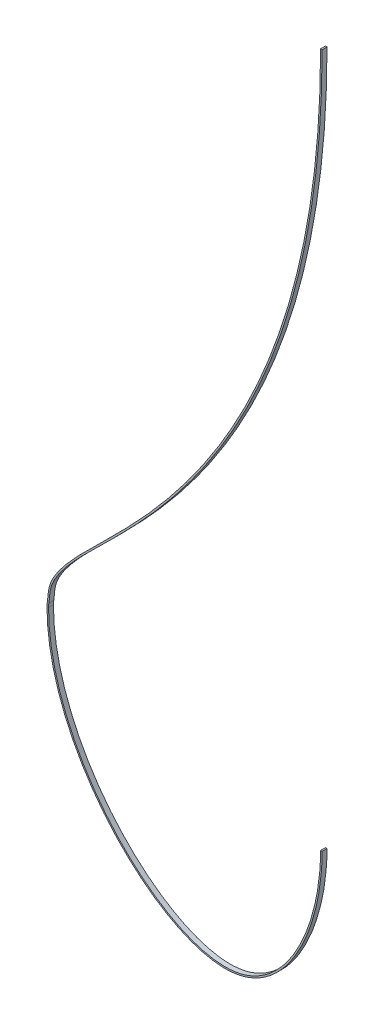
ISO-10303-21;
HEADER;
FILE_DESCRIPTION(('STEP AP214'),'2;1');
FILE_NAME('part.step','',(''),(''),'','','');
FILE_SCHEMA(('AUTOMOTIVE_DESIGN { 1 0 10303 214 1 1 1 1 }'));
ENDSEC;
DATA;
#1=APPLICATION_CONTEXT('core data for automotive mechanical design processes');
#2=APPLICATION_PROTOCOL_DEFINITION('international standard','automotive_design',2000,#1);
#3=PRODUCT_CONTEXT('',#1,'mechanical');
#4=PRODUCT('Part','Part','',(#3));
#5=PRODUCT_RELATED_PRODUCT_CATEGORY('part','',(#4));
#6=PRODUCT_DEFINITION_FORMATION('','',#4);
#7=PRODUCT_DEFINITION_CONTEXT('part definition',#1,'design');
#8=PRODUCT_DEFINITION('design','',#6,#7);
#9=PRODUCT_DEFINITION_SHAPE('','',#8);
#10=(LENGTH_UNIT() NAMED_UNIT(*) SI_UNIT(.MILLI.,.METRE.));
#11=(NAMED_UNIT(*) PLANE_ANGLE_UNIT() SI_UNIT($,.RADIAN.));
#12=(NAMED_UNIT(*) SI_UNIT($,.STERADIAN.) SOLID_ANGLE_UNIT());
#13=UNCERTAINTY_MEASURE_WITH_UNIT(LENGTH_MEASURE(1.E-05),#10,'distance_accuracy_value','');
#14=(GEOMETRIC_REPRESENTATION_CONTEXT(3) GLOBAL_UNCERTAINTY_ASSIGNED_CONTEXT((#13)) GLOBAL_UNIT_ASSIGNED_CONTEXT((#10,
#11,#12)) REPRESENTATION_CONTEXT('',''));
#15=CARTESIAN_POINT('',(0.,0.,0.));
#16=DIRECTION('',(0.,0.,1.));
#17=DIRECTION('',(1.,0.,0.));
#18=AXIS2_PLACEMENT_3D('',#15,#16,#17);
#19=CARTESIAN_POINT('',(-662.178,457.2,0.));
#20=DIRECTION('',(0.,0.,1.));
#21=DIRECTION('',(1.,0.,0.));
#22=AXIS2_PLACEMENT_3D('',#19,#20,#21);
#23=CYLINDRICAL_SURFACE('',#22,52.3875);
#24=DIRECTION('',(0.,0.,1.));
#25=VECTOR('',#24,1.);
#26=CARTESIAN_POINT('',(-713.845904547921,465.853195703148,-5.00000000000004));
#27=LINE('',#26,#25);
#28=CARTESIAN_POINT('',(-713.845904547921,465.853195703148,-5.00000000000004));
#29=VERTEX_POINT('',#28);
#30=CARTESIAN_POINT('',(-713.845904547921,465.853195703148,4.99999999999996));
#31=VERTEX_POINT('',#30);
#32=EDGE_CURVE('E129',#29,#31,#27,.T.);
#33=ORIENTED_EDGE('',*,*,#32,.F.);
#34=CARTESIAN_POINT('',(-662.178,457.2,-5.00000000000004));
#35=DIRECTION('',(0.,0.,1.));
#36=DIRECTION('',(1.,0.,0.));
#37=AXIS2_PLACEMENT_3D('',#34,#35,#36);
#38=CIRCLE('',#37,52.3875);
#39=CARTESIAN_POINT('',(-714.5655,457.199999999998,-5.00000000000004));
#40=VERTEX_POINT('',#39);
#41=EDGE_CURVE('E170',#29,#40,#38,.T.);
#42=ORIENTED_EDGE('',*,*,#41,.T.);
#43=DIRECTION('',(0.,0.,1.));
#44=VECTOR('',#43,1.);
#45=CARTESIAN_POINT('',(-714.5655,457.199999999998,-5.00000000000004));
#46=LINE('',#45,#44);
#47=CARTESIAN_POINT('',(-714.5655,457.199999999998,4.99999999999996));
#48=VERTEX_POINT('',#47);
#49=EDGE_CURVE('E166',#40,#48,#46,.T.);
#50=ORIENTED_EDGE('',*,*,#49,.T.);
#51=CARTESIAN_POINT('',(-662.178,457.2,4.99999999999996));
#52=DIRECTION('',(0.,0.,1.));
#53=DIRECTION('',(1.,0.,0.));
#54=AXIS2_PLACEMENT_3D('',#51,#52,#53);
#55=CIRCLE('',#54,52.3875);
#56=EDGE_CURVE('E77',#31,#48,#55,.T.);
#57=ORIENTED_EDGE('',*,*,#56,.F.);
#58=EDGE_LOOP('',(#33,#42,#50,#57));
#59=FACE_BOUND('',#58,.T.);
#60=ADVANCED_FACE('F69',(#59),#23,.T.);
#61=CARTESIAN_POINT('',(-662.178,457.2,0.));
#62=DIRECTION('',(0.,0.,1.));
#63=DIRECTION('',(1.,0.,0.));
#64=AXIS2_PLACEMENT_3D('',#61,#62,#63);
#65=CYLINDRICAL_SURFACE('',#64,49.2125);
#66=DIRECTION('',(0.,0.,-1.));
#67=VECTOR('',#66,1.);
#68=CARTESIAN_POINT('',(-710.714516393501,465.328759599926,-5.00000000000004));
#69=LINE('',#68,#67);
#70=CARTESIAN_POINT('',(-710.714516393501,465.328759599926,4.99999999999996));
#71=VERTEX_POINT('',#70);
#72=CARTESIAN_POINT('',(-710.714516393501,465.328759599926,-5.00000000000004));
#73=VERTEX_POINT('',#72);
#74=EDGE_CURVE('E122',#71,#73,#69,.T.);
#75=ORIENTED_EDGE('',*,*,#74,.F.);
#76=CARTESIAN_POINT('',(-662.178,457.2,4.99999999999996));
#77=DIRECTION('',(0.,0.,1.));
#78=DIRECTION('',(1.,0.,0.));
#79=AXIS2_PLACEMENT_3D('',#76,#77,#78);
#80=CIRCLE('',#79,49.2125);
#81=CARTESIAN_POINT('',(-711.3905,457.199999999998,4.99999999999996));
#82=VERTEX_POINT('',#81);
#83=EDGE_CURVE('E12',#71,#82,#80,.T.);
#84=ORIENTED_EDGE('',*,*,#83,.T.);
#85=DIRECTION('',(0.,0.,-1.));
#86=VECTOR('',#85,1.);
#87=CARTESIAN_POINT('',(-711.3905,457.199999999998,-5.00000000000004));
#88=LINE('',#87,#86);
#89=CARTESIAN_POINT('',(-711.3905,457.199999999998,-5.00000000000004));
#90=VERTEX_POINT('',#89);
#91=EDGE_CURVE('E164',#82,#90,#88,.T.);
#92=ORIENTED_EDGE('',*,*,#91,.T.);
#93=CARTESIAN_POINT('',(-662.178,457.2,-5.00000000000004));
#94=DIRECTION('',(0.,0.,1.));
#95=DIRECTION('',(1.,0.,0.));
#96=AXIS2_PLACEMENT_3D('',#93,#94,#95);
#97=CIRCLE('',#96,49.2125);
#98=EDGE_CURVE('E125',#73,#90,#97,.T.);
#99=ORIENTED_EDGE('',*,*,#98,.F.);
#100=EDGE_LOOP('',(#75,#84,#92,#99));
#101=FACE_BOUND('',#100,.T.);
#102=ADVANCED_FACE('F123',(#101),#65,.F.);
#103=CARTESIAN_POINT('',(0.,1727.2,0.));
#104=DIRECTION('',(0.,1.,0.));
#105=DIRECTION('',(0.,0.,1.));
#106=AXIS2_PLACEMENT_3D('',#103,#104,#105);
#107=PLANE('',#106);
#108=DIRECTION('',(0.,0.,-1.));
#109=VECTOR('',#108,1.);
#110=CARTESIAN_POINT('',(-150.8125,1727.2,-5.00000000000004));
#111=LINE('',#110,#109);
#112=CARTESIAN_POINT('',(-150.8125,1727.2,4.99999999999996));
#113=VERTEX_POINT('',#112);
#114=CARTESIAN_POINT('',(-150.8125,1727.2,-5.00000000000004));
#115=VERTEX_POINT('',#114);
#116=EDGE_CURVE('E133',#113,#115,#111,.T.);
#117=ORIENTED_EDGE('',*,*,#116,.T.);
#118=DIRECTION('',(-1.,0.,0.));
#119=VECTOR('',#118,1.);
#120=CARTESIAN_POINT('',(-153.9875,1727.2,-5.00000000000004));
#121=LINE('',#120,#119);
#122=CARTESIAN_POINT('',(-153.9875,1727.2,-5.00000000000004));
#123=VERTEX_POINT('',#122);
#124=EDGE_CURVE('E191',#115,#123,#121,.T.);
#125=ORIENTED_EDGE('',*,*,#124,.T.);
#126=DIRECTION('',(0.,0.,1.));
#127=VECTOR('',#126,1.);
#128=CARTESIAN_POINT('',(-153.9875,1727.2,-5.00000000000004));
#129=LINE('',#128,#127);
#130=CARTESIAN_POINT('',(-153.9875,1727.2,4.99999999999996));
#131=VERTEX_POINT('',#130);
#132=EDGE_CURVE('E187',#123,#131,#129,.T.);
#133=ORIENTED_EDGE('',*,*,#132,.T.);
#134=DIRECTION('',(1.,0.,0.));
#135=VECTOR('',#134,1.);
#136=CARTESIAN_POINT('',(-153.9875,1727.2,4.99999999999996));
#137=LINE('',#136,#135);
#138=EDGE_CURVE('E93',#131,#113,#137,.T.);
#139=ORIENTED_EDGE('',*,*,#138,.T.);
#140=EDGE_LOOP('',(#117,#125,#133,#139));
#141=FACE_BOUND('',#140,.T.);
#142=ADVANCED_FACE('F193',(#141),#107,.T.);
#143=CARTESIAN_POINT('',(-153.9875,1727.2,-5.00000000000004));
#144=DIRECTION('',(0.,0.,-1.));
#145=DIRECTION('',(1.,0.,0.));
#146=AXIS2_PLACEMENT_3D('',#143,#144,#145);
#147=PLANE('',#146);
#148=ORIENTED_EDGE('',*,*,#124,.F.);
#149=CARTESIAN_POINT('',(-150.8125,1727.2,-5.00000000000004));
#150=CARTESIAN_POINT('',(-150.814799897459,1640.91806785502,-5.00000000000004));
#151=CARTESIAN_POINT('',(-161.343105511517,1480.52590303035,-5.00000000000004));
#152=CARTESIAN_POINT('',(-202.464346560498,1273.79750332227,-5.00000000000004));
#153=CARTESIAN_POINT('',(-262.628743902861,1098.30373897934,-5.00000000000004));
#154=CARTESIAN_POINT('',(-335.554381941669,951.412457839863,-5.00000000000004));
#155=CARTESIAN_POINT('',(-425.538625543784,814.365878983146,-5.00000000000004));
#156=CARTESIAN_POINT('',(-526.38005079256,696.660649932838,-5.00000000000004));
#157=CARTESIAN_POINT('',(-601.036891357142,624.311001682325,-5.00000000000004));
#158=CARTESIAN_POINT('',(-643.342486757114,582.543207888005,-5.00000000000004));
#159=CARTESIAN_POINT('',(-672.218671205828,551.680321344073,-5.00000000000004));
#160=CARTESIAN_POINT('',(-692.637616736616,525.309348448782,-5.00000000000004));
#161=CARTESIAN_POINT('',(-703.871393344839,504.427665214112,-5.00000000000004));
#162=CARTESIAN_POINT('',(-708.145549087391,489.953306059103,-5.00000000000004));
#163=CARTESIAN_POINT('',(-709.377312138674,477.746808274792,-5.00000000000004));
#164=CARTESIAN_POINT('',(-709.997431412902,469.630064493446,-5.00000000000004));
#165=CARTESIAN_POINT('',(-710.714516393501,465.328759599929,-5.00000000000004));
#166=B_SPLINE_CURVE_WITH_KNOTS('',3,(#149,#150,#151,#152,#153,#154,#155,#156,#157,#158,#159,
#160,#161,#162,#163,#164,#165),.UNSPECIFIED.,.F.,.F.,(4,1,1,1,1,1,1,1,1,1,1,1,1,1,4),(0.,
0.0750000000000001,0.15,0.225,0.3,0.374999999999992,0.48,0.585,0.62373017656748,0.6675,0.75,
0.8125,0.875,0.937499999999999,1.),.UNSPECIFIED.);
#167=EDGE_CURVE('E144',#115,#73,#166,.T.);
#168=ORIENTED_EDGE('',*,*,#167,.T.);
#169=ORIENTED_EDGE('',*,*,#98,.T.);
#170=CARTESIAN_POINT('',(-711.3905,457.199999999998,-5.00000000000004));
#171=CARTESIAN_POINT('',(-711.3905,416.797448450927,-5.00000000000004));
#172=CARTESIAN_POINT('',(-699.013160581146,337.01466953898,-5.00000000000004));
#173=CARTESIAN_POINT('',(-651.493294783347,226.247070867454,-5.00000000000004));
#174=CARTESIAN_POINT('',(-594.616584545603,146.480007428481,-5.00000000000004));
#175=CARTESIAN_POINT('',(-542.884063940633,93.2253739517064,-5.00000000000004));
#176=CARTESIAN_POINT('',(-502.007661754814,59.3245600084066,-5.00000000000004));
#177=CARTESIAN_POINT('',(-460.09614680618,32.2212082679032,-5.00000000000004));
#178=CARTESIAN_POINT('',(-418.197918084497,12.6689120076457,-5.00000000000004));
#179=CARTESIAN_POINT('',(-377.365782505513,1.41059973280028,-5.00000000000004));
#180=CARTESIAN_POINT('',(-348.788889720504,-0.243668298404423,-5.00000000000004));
#181=CARTESIAN_POINT('',(-324.253232159255,2.19214618101526,-5.00000000000004));
#182=CARTESIAN_POINT('',(-300.822633625439,7.9184451087711,-5.00000000000004));
#183=CARTESIAN_POINT('',(-270.941414743852,23.297738169709,-5.00000000000004));
#184=CARTESIAN_POINT('',(-242.232921334138,47.6488267356133,-5.00000000000004));
#185=CARTESIAN_POINT('',(-210.693622145506,86.6279824297649,-5.00000000000004));
#186=CARTESIAN_POINT('',(-180.800006444272,145.012871593731,-5.00000000000004));
#187=CARTESIAN_POINT('',(-159.032292898986,223.558453337882,-5.00000000000004));
#188=CARTESIAN_POINT('',(-153.9875,278.113620890682,-5.00000000000004));
#189=CARTESIAN_POINT('',(-153.9875,304.800000000003,-5.00000000000004));
#190=B_SPLINE_CURVE_WITH_KNOTS('',3,(#170,#171,#172,#173,#174,#175,#176,#177,#178,#179,#180,
#181,#182,#183,#184,#185,#186,#187,#188,#189),.UNSPECIFIED.,.F.,.F.,(4,1,1,1,1,1,1,1,1,1,1,1,1,
1,1,1,1,4),(0.,0.09375,0.1875,0.28125,0.328125,0.375,0.421875,0.46875,0.515625,0.5625,
0.572577910858476,0.609374999999989,0.65625,0.703125,0.75,0.833333333333333,0.916666666666671,
1.),.UNSPECIFIED.);
#191=CARTESIAN_POINT('',(-153.9875,304.800000000005,-5.00000000000004));
#192=VERTEX_POINT('',#191);
#193=EDGE_CURVE('E130',#90,#192,#190,.T.);
#194=ORIENTED_EDGE('',*,*,#193,.T.);
#195=DIRECTION('',(1.,0.,0.));
#196=VECTOR('',#195,1.);
#197=CARTESIAN_POINT('',(-150.8125,304.800000000004,-5.00000000000004));
#198=LINE('',#197,#196);
#199=CARTESIAN_POINT('',(-150.8125,304.800000000004,-5.00000000000004));
#200=VERTEX_POINT('',#199);
#201=EDGE_CURVE('E198',#192,#200,#198,.T.);
#202=ORIENTED_EDGE('',*,*,#201,.T.);
#203=CARTESIAN_POINT('',(-714.5655,457.199999999998,-5.00000000000004));
#204=CARTESIAN_POINT('',(-714.5655,416.502867374053,-5.00000000000004));
#205=CARTESIAN_POINT('',(-702.089351521857,336.089876575185,-5.00000000000004));
#206=CARTESIAN_POINT('',(-654.276158217967,224.674813740993,-5.00000000000004));
#207=CARTESIAN_POINT('',(-597.087660186465,144.465651232975,-5.00000000000004));
#208=CARTESIAN_POINT('',(-545.049236982732,90.8949977685081,-5.00000000000004));
#209=CARTESIAN_POINT('',(-503.901497269719,56.7672180740872,-5.00000000000004));
#210=CARTESIAN_POINT('',(-461.656390831567,29.4448724040563,-5.00000000000004));
#211=CARTESIAN_POINT('',(-419.328973232856,9.68689214022288,-5.00000000000004));
#212=CARTESIAN_POINT('',(-377.929892112188,-1.73712656339474,-5.00000000000004));
#213=CARTESIAN_POINT('',(-348.788926757676,-3.43625882044976,-5.00000000000004));
#214=CARTESIAN_POINT('',(-323.688162166503,-0.940547489630957,-5.00000000000004));
#215=CARTESIAN_POINT('',(-299.67066255857,4.92407297818737,-5.00000000000004));
#216=CARTESIAN_POINT('',(-269.13691588198,20.6526627625111,-5.00000000000004));
#217=CARTESIAN_POINT('',(-239.927817325648,45.4384979141446,-5.00000000000004));
#218=CARTESIAN_POINT('',(-207.972393783042,84.9454630766073,-5.00000000000004));
#219=CARTESIAN_POINT('',(-177.811394541594,143.88423356694,-5.00000000000004));
#220=CARTESIAN_POINT('',(-155.8928583314,222.983591359847,-5.00000000000004));
#221=CARTESIAN_POINT('',(-150.8125,277.922425643865,-5.00000000000004));
#222=CARTESIAN_POINT('',(-150.8125,304.800000000003,-5.00000000000004));
#223=B_SPLINE_CURVE_WITH_KNOTS('',3,(#203,#204,#205,#206,#207,#208,#209,#210,#211,#212,#213,
#214,#215,#216,#217,#218,#219,#220,#221,#222),.UNSPECIFIED.,.F.,.F.,(4,1,1,1,1,1,1,1,1,1,1,1,1,
1,1,1,1,4),(0.,0.09375,0.1875,0.28125,0.328125,0.375,0.421875,0.46875,0.515625,0.5625,
0.572577910858476,0.609374999999989,0.65625,0.703125,0.75,0.833333333333333,0.916666666666671,
1.),.UNSPECIFIED.);
#224=EDGE_CURVE('E209',#40,#200,#223,.T.);
#225=ORIENTED_EDGE('',*,*,#224,.F.);
#226=ORIENTED_EDGE('',*,*,#41,.F.);
#227=CARTESIAN_POINT('',(-153.9875,1727.2,-5.00000000000004));
#228=CARTESIAN_POINT('',(-153.985200102541,1641.05044496847,-5.00000000000004));
#229=CARTESIAN_POINT('',(-164.504306126765,1480.92303437069,-5.00000000000004));
#230=CARTESIAN_POINT('',(-205.54217932409,1274.61353258049,-5.00000000000004));
#231=CARTESIAN_POINT('',(-265.57065489096,1099.52212190425,-5.00000000000004));
#232=CARTESIAN_POINT('',(-338.317410298348,952.992219347421,-5.00000000000004));
#233=CARTESIAN_POINT('',(-428.077199334403,816.28674700376,-5.00000000000004));
#234=CARTESIAN_POINT('',(-528.690150818039,698.845313118707,-5.00000000000004));
#235=CARTESIAN_POINT('',(-603.222868785446,626.614307191918,-5.00000000000004));
#236=CARTESIAN_POINT('',(-645.608156087054,584.767836948238,-5.00000000000004));
#237=CARTESIAN_POINT('',(-674.616857977167,553.765773211199,-5.00000000000004));
#238=CARTESIAN_POINT('',(-695.246932675654,527.142734288412,-5.00000000000004));
#239=CARTESIAN_POINT('',(-706.798093828687,505.721304440024,-5.00000000000004));
#240=CARTESIAN_POINT('',(-711.283754419336,490.559150461802,-5.00000000000004));
#241=CARTESIAN_POINT('',(-712.553920509421,477.883530741436,-5.00000000000004));
#242=CARTESIAN_POINT('',(-713.143892972764,470.025262717808,-5.00000000000004));
#243=CARTESIAN_POINT('',(-713.84590454792,465.85319570315,-5.00000000000004));
#244=B_SPLINE_CURVE_WITH_KNOTS('',3,(#227,#228,#229,#230,#231,#232,#233,#234,#235,#236,#237,
#238,#239,#240,#241,#242,#243),.UNSPECIFIED.,.F.,.F.,(4,1,1,1,1,1,1,1,1,1,1,1,1,1,4),(0.,
0.0750000000000001,0.15,0.225,0.3,0.374999999999992,0.48,0.585,0.62373017656748,0.6675,0.75,
0.8125,0.875,0.937499999999999,1.),.UNSPECIFIED.);
#245=EDGE_CURVE('E137',#123,#29,#244,.T.);
#246=ORIENTED_EDGE('',*,*,#245,.F.);
#247=EDGE_LOOP('',(#148,#168,#169,#194,#202,#225,#226,#246));
#248=FACE_BOUND('',#247,.T.);
#249=ADVANCED_FACE('F190',(#248),#147,.T.);
#250=CARTESIAN_POINT('',(-153.9875,1727.2,4.99999999999996));
#251=CARTESIAN_POINT('',(-153.985200102541,1641.05044496847,4.99999999999996));
#252=CARTESIAN_POINT('',(-164.504306126765,1480.92303437069,4.99999999999996));
#253=CARTESIAN_POINT('',(-205.54217932409,1274.61353258049,4.99999999999996));
#254=CARTESIAN_POINT('',(-265.57065489096,1099.52212190425,4.99999999999996));
#255=CARTESIAN_POINT('',(-338.317410298348,952.992219347421,4.99999999999996));
#256=CARTESIAN_POINT('',(-428.077199334403,816.28674700376,4.99999999999996));
#257=CARTESIAN_POINT('',(-528.690150818039,698.845313118707,4.99999999999996));
#258=CARTESIAN_POINT('',(-603.222868785446,626.614307191918,4.99999999999996));
#259=CARTESIAN_POINT('',(-645.608156087054,584.767836948238,4.99999999999996));
#260=CARTESIAN_POINT('',(-674.616857977167,553.765773211199,4.99999999999996));
#261=CARTESIAN_POINT('',(-695.246932675654,527.142734288412,4.99999999999996));
#262=CARTESIAN_POINT('',(-706.798093828687,505.721304440024,4.99999999999996));
#263=CARTESIAN_POINT('',(-711.283754419336,490.559150461802,4.99999999999996));
#264=CARTESIAN_POINT('',(-712.553920509421,477.883530741436,4.99999999999996));
#265=CARTESIAN_POINT('',(-713.143892972764,470.025262717808,4.99999999999996));
#266=CARTESIAN_POINT('',(-713.84590454792,465.85319570315,4.99999999999996));
#267=CARTESIAN_POINT('',(-153.9875,1727.2,-5.00000000000004));
#268=CARTESIAN_POINT('',(-153.985200102541,1641.05044496847,-5.00000000000004));
#269=CARTESIAN_POINT('',(-164.504306126765,1480.92303437069,-5.00000000000004));
#270=CARTESIAN_POINT('',(-205.54217932409,1274.61353258049,-5.00000000000004));
#271=CARTESIAN_POINT('',(-265.57065489096,1099.52212190425,-5.00000000000004));
#272=CARTESIAN_POINT('',(-338.317410298348,952.992219347421,-5.00000000000004));
#273=CARTESIAN_POINT('',(-428.077199334403,816.28674700376,-5.00000000000004));
#274=CARTESIAN_POINT('',(-528.690150818039,698.845313118707,-5.00000000000004));
#275=CARTESIAN_POINT('',(-603.222868785446,626.614307191918,-5.00000000000004));
#276=CARTESIAN_POINT('',(-645.608156087054,584.767836948238,-5.00000000000004));
#277=CARTESIAN_POINT('',(-674.616857977167,553.765773211199,-5.00000000000004));
#278=CARTESIAN_POINT('',(-695.246932675654,527.142734288412,-5.00000000000004));
#279=CARTESIAN_POINT('',(-706.798093828687,505.721304440024,-5.00000000000004));
#280=CARTESIAN_POINT('',(-711.283754419336,490.559150461802,-5.00000000000004));
#281=CARTESIAN_POINT('',(-712.553920509421,477.883530741436,-5.00000000000004));
#282=CARTESIAN_POINT('',(-713.143892972764,470.025262717808,-5.00000000000004));
#283=CARTESIAN_POINT('',(-713.84590454792,465.85319570315,-5.00000000000004));
#284=B_SPLINE_SURFACE_WITH_KNOTS('',1,3,((#250,#251,#252,#253,#254,#255,#256,#257,#258,#259,
#260,#261,#262,#263,#264,#265,#266),(#267,#268,#269,#270,#271,#272,#273,#274,#275,#276,#277,
#278,#279,#280,#281,#282,#283)),.UNSPECIFIED.,.F.,.F.,.F.,(2,2),(4,1,1,1,1,1,1,1,1,1,1,1,1,1,4),
(0.5,0.879506641366224),(0.,0.0750000000000001,0.15,0.225,0.3,0.374999999999992,0.48,0.585,
0.62373017656748,0.6675,0.75,0.8125,0.875,0.937499999999999,1.),.UNSPECIFIED.);
#285=CARTESIAN_POINT('',(-153.9875,1727.2,4.99999999999996));
#286=CARTESIAN_POINT('',(-153.985200102541,1641.05044496847,4.99999999999996));
#287=CARTESIAN_POINT('',(-164.504306126765,1480.92303437069,4.99999999999996));
#288=CARTESIAN_POINT('',(-205.54217932409,1274.61353258049,4.99999999999996));
#289=CARTESIAN_POINT('',(-265.57065489096,1099.52212190425,4.99999999999996));
#290=CARTESIAN_POINT('',(-338.317410298348,952.992219347421,4.99999999999996));
#291=CARTESIAN_POINT('',(-428.077199334403,816.28674700376,4.99999999999996));
#292=CARTESIAN_POINT('',(-528.690150818039,698.845313118707,4.99999999999996));
#293=CARTESIAN_POINT('',(-603.222868785446,626.614307191918,4.99999999999996));
#294=CARTESIAN_POINT('',(-645.608156087054,584.767836948238,4.99999999999996));
#295=CARTESIAN_POINT('',(-674.616857977167,553.765773211199,4.99999999999996));
#296=CARTESIAN_POINT('',(-695.246932675654,527.142734288412,4.99999999999996));
#297=CARTESIAN_POINT('',(-706.798093828687,505.721304440024,4.99999999999996));
#298=CARTESIAN_POINT('',(-711.283754419336,490.559150461802,4.99999999999996));
#299=CARTESIAN_POINT('',(-712.553920509421,477.883530741436,4.99999999999996));
#300=CARTESIAN_POINT('',(-713.143892972764,470.025262717808,4.99999999999996));
#301=CARTESIAN_POINT('',(-713.84590454792,465.85319570315,4.99999999999996));
#302=B_SPLINE_CURVE_WITH_KNOTS('',3,(#285,#286,#287,#288,#289,#290,#291,#292,#293,#294,#295,
#296,#297,#298,#299,#300,#301),.UNSPECIFIED.,.F.,.F.,(4,1,1,1,1,1,1,1,1,1,1,1,1,1,4),(0.,
0.0750000000000001,0.15,0.225,0.3,0.374999999999992,0.48,0.585,0.62373017656748,0.6675,0.75,
0.8125,0.875,0.937499999999999,1.),.UNSPECIFIED.);
#303=EDGE_CURVE('E134',#131,#31,#302,.T.);
#304=ORIENTED_EDGE('',*,*,#132,.F.);
#305=ORIENTED_EDGE('',*,*,#245,.T.);
#306=ORIENTED_EDGE('',*,*,#32,.T.);
#307=ORIENTED_EDGE('',*,*,#303,.F.);
#308=EDGE_LOOP('',(#304,#305,#306,#307));
#309=FACE_BOUND('',#308,.T.);
#310=ADVANCED_FACE('F185',(#309),#284,.T.);
#311=CARTESIAN_POINT('',(-150.8125,1727.2,4.99999999999996));
#312=DIRECTION('',(0.,0.,1.));
#313=DIRECTION('',(-1.,0.,0.));
#314=AXIS2_PLACEMENT_3D('',#311,#312,#313);
#315=PLANE('',#314);
#316=ORIENTED_EDGE('',*,*,#138,.F.);
#317=ORIENTED_EDGE('',*,*,#303,.T.);
#318=ORIENTED_EDGE('',*,*,#56,.T.);
#319=CARTESIAN_POINT('',(-714.5655,457.199999999998,4.99999999999996));
#320=CARTESIAN_POINT('',(-714.5655,416.502867374053,4.99999999999996));
#321=CARTESIAN_POINT('',(-702.089351521857,336.089876575185,4.99999999999996));
#322=CARTESIAN_POINT('',(-654.276158217967,224.674813740993,4.99999999999996));
#323=CARTESIAN_POINT('',(-597.087660186465,144.465651232975,4.99999999999996));
#324=CARTESIAN_POINT('',(-545.049236982732,90.894997768508,4.99999999999996));
#325=CARTESIAN_POINT('',(-503.901497269719,56.7672180740873,4.99999999999996));
#326=CARTESIAN_POINT('',(-461.656390831567,29.4448724040563,4.99999999999996));
#327=CARTESIAN_POINT('',(-419.328973232856,9.68689214022289,4.99999999999996));
#328=CARTESIAN_POINT('',(-377.929892112188,-1.73712656339474,4.99999999999996));
#329=CARTESIAN_POINT('',(-348.788926757676,-3.43625882044976,4.99999999999996));
#330=CARTESIAN_POINT('',(-323.688162166503,-0.940547489630957,4.99999999999996));
#331=CARTESIAN_POINT('',(-299.67066255857,4.92407297818737,4.99999999999996));
#332=CARTESIAN_POINT('',(-269.13691588198,20.6526627625111,4.99999999999996));
#333=CARTESIAN_POINT('',(-239.927817325647,45.4384979141446,4.99999999999996));
#334=CARTESIAN_POINT('',(-207.972393783042,84.9454630766073,4.99999999999996));
#335=CARTESIAN_POINT('',(-177.811394541594,143.88423356694,4.99999999999996));
#336=CARTESIAN_POINT('',(-155.8928583314,222.983591359847,4.99999999999996));
#337=CARTESIAN_POINT('',(-150.8125,277.922425643865,4.99999999999996));
#338=CARTESIAN_POINT('',(-150.8125,304.800000000003,4.99999999999996));
#339=B_SPLINE_CURVE_WITH_KNOTS('',3,(#319,#320,#321,#322,#323,#324,#325,#326,#327,#328,#329,
#330,#331,#332,#333,#334,#335,#336,#337,#338),.UNSPECIFIED.,.F.,.F.,(4,1,1,1,1,1,1,1,1,1,1,1,1,
1,1,1,1,4),(0.,0.09375,0.1875,0.28125,0.328125,0.375,0.421875,0.46875,0.515625,0.5625,
0.572577910858476,0.609374999999989,0.65625,0.703125,0.75,0.833333333333333,0.916666666666671,
1.),.UNSPECIFIED.);
#340=CARTESIAN_POINT('',(-150.8125,304.800000000003,4.99999999999996));
#341=VERTEX_POINT('',#340);
#342=EDGE_CURVE('E177',#48,#341,#339,.T.);
#343=ORIENTED_EDGE('',*,*,#342,.T.);
#344=DIRECTION('',(-1.,0.,0.));
#345=VECTOR('',#344,1.);
#346=CARTESIAN_POINT('',(-150.8125,304.800000000004,4.99999999999996));
#347=LINE('',#346,#345);
#348=CARTESIAN_POINT('',(-153.9875,304.800000000003,4.99999999999996));
#349=VERTEX_POINT('',#348);
#350=EDGE_CURVE('E204',#341,#349,#347,.T.);
#351=ORIENTED_EDGE('',*,*,#350,.T.);
#352=CARTESIAN_POINT('',(-711.3905,457.199999999998,4.99999999999996));
#353=CARTESIAN_POINT('',(-711.3905,416.797448450927,4.99999999999996));
#354=CARTESIAN_POINT('',(-699.013160581147,337.01466953898,4.99999999999996));
#355=CARTESIAN_POINT('',(-651.493294783347,226.247070867454,4.99999999999996));
#356=CARTESIAN_POINT('',(-594.616584545603,146.480007428481,4.99999999999996));
#357=CARTESIAN_POINT('',(-542.884063940633,93.2253739517065,4.99999999999996));
#358=CARTESIAN_POINT('',(-502.007661754814,59.3245600084067,4.99999999999996));
#359=CARTESIAN_POINT('',(-460.09614680618,32.2212082679033,4.99999999999996));
#360=CARTESIAN_POINT('',(-418.197918084497,12.6689120076457,4.99999999999996));
#361=CARTESIAN_POINT('',(-377.365782505513,1.41059973280029,4.99999999999996));
#362=CARTESIAN_POINT('',(-348.788889720505,-0.243668298404433,4.99999999999996));
#363=CARTESIAN_POINT('',(-324.253232159255,2.19214618101527,4.99999999999996));
#364=CARTESIAN_POINT('',(-300.822633625439,7.91844510877114,4.99999999999996));
#365=CARTESIAN_POINT('',(-270.941414743852,23.2977381697088,4.99999999999996));
#366=CARTESIAN_POINT('',(-242.232921334138,47.6488267356134,4.99999999999996));
#367=CARTESIAN_POINT('',(-210.693622145507,86.6279824297646,4.99999999999996));
#368=CARTESIAN_POINT('',(-180.800006444272,145.012871593731,4.99999999999996));
#369=CARTESIAN_POINT('',(-159.032292898986,223.558453337881,4.99999999999996));
#370=CARTESIAN_POINT('',(-153.9875,278.113620890682,4.99999999999996));
#371=CARTESIAN_POINT('',(-153.9875,304.800000000003,4.99999999999996));
#372=B_SPLINE_CURVE_WITH_KNOTS('',3,(#352,#353,#354,#355,#356,#357,#358,#359,#360,#361,#362,
#363,#364,#365,#366,#367,#368,#369,#370,#371),.UNSPECIFIED.,.F.,.F.,(4,1,1,1,1,1,1,1,1,1,1,1,1,
1,1,1,1,4),(0.,0.09375,0.1875,0.28125,0.328125,0.375,0.421875,0.46875,0.515625,0.5625,
0.572577910858476,0.609374999999989,0.65625,0.703125,0.75,0.833333333333333,0.916666666666671,
1.),.UNSPECIFIED.);
#373=EDGE_CURVE('E84',#82,#349,#372,.T.);
#374=ORIENTED_EDGE('',*,*,#373,.F.);
#375=ORIENTED_EDGE('',*,*,#83,.F.);
#376=CARTESIAN_POINT('',(-150.8125,1727.2,4.99999999999996));
#377=CARTESIAN_POINT('',(-150.814799897459,1640.91806785502,4.99999999999996));
#378=CARTESIAN_POINT('',(-161.343105511517,1480.52590303035,4.99999999999996));
#379=CARTESIAN_POINT('',(-202.464346560498,1273.79750332227,4.99999999999996));
#380=CARTESIAN_POINT('',(-262.628743902861,1098.30373897934,4.99999999999996));
#381=CARTESIAN_POINT('',(-335.554381941669,951.412457839863,4.99999999999996));
#382=CARTESIAN_POINT('',(-425.538625543784,814.365878983146,4.99999999999996));
#383=CARTESIAN_POINT('',(-526.38005079256,696.660649932838,4.99999999999996));
#384=CARTESIAN_POINT('',(-601.036891357142,624.311001682325,4.99999999999996));
#385=CARTESIAN_POINT('',(-643.342486757114,582.543207888005,4.99999999999996));
#386=CARTESIAN_POINT('',(-672.218671205828,551.680321344073,4.99999999999996));
#387=CARTESIAN_POINT('',(-692.637616736616,525.309348448782,4.99999999999996));
#388=CARTESIAN_POINT('',(-703.871393344839,504.427665214112,4.99999999999996));
#389=CARTESIAN_POINT('',(-708.145549087391,489.953306059103,4.99999999999996));
#390=CARTESIAN_POINT('',(-709.377312138674,477.746808274792,4.99999999999996));
#391=CARTESIAN_POINT('',(-709.997431412902,469.630064493446,4.99999999999996));
#392=CARTESIAN_POINT('',(-710.714516393501,465.328759599929,4.99999999999996));
#393=B_SPLINE_CURVE_WITH_KNOTS('',3,(#376,#377,#378,#379,#380,#381,#382,#383,#384,#385,#386,
#387,#388,#389,#390,#391,#392),.UNSPECIFIED.,.F.,.F.,(4,1,1,1,1,1,1,1,1,1,1,1,1,1,4),(0.,
0.0750000000000001,0.15,0.225,0.3,0.374999999999992,0.48,0.585,0.62373017656748,0.6675,0.75,
0.8125,0.875,0.937499999999999,1.),.UNSPECIFIED.);
#394=EDGE_CURVE('E118',#113,#71,#393,.T.);
#395=ORIENTED_EDGE('',*,*,#394,.F.);
#396=EDGE_LOOP('',(#316,#317,#318,#343,#351,#374,#375,#395));
#397=FACE_BOUND('',#396,.T.);
#398=ADVANCED_FACE('F71',(#397),#315,.T.);
#399=CARTESIAN_POINT('',(-150.8125,1727.2,-5.00000000000004));
#400=CARTESIAN_POINT('',(-150.814799897459,1640.91806785502,-5.00000000000004));
#401=CARTESIAN_POINT('',(-161.343105511517,1480.52590303035,-5.00000000000004));
#402=CARTESIAN_POINT('',(-202.464346560498,1273.79750332227,-5.00000000000004));
#403=CARTESIAN_POINT('',(-262.628743902861,1098.30373897934,-5.00000000000004));
#404=CARTESIAN_POINT('',(-335.554381941669,951.412457839863,-5.00000000000004));
#405=CARTESIAN_POINT('',(-425.538625543784,814.365878983146,-5.00000000000004));
#406=CARTESIAN_POINT('',(-526.38005079256,696.660649932838,-5.00000000000004));
#407=CARTESIAN_POINT('',(-601.036891357142,624.311001682325,-5.00000000000004));
#408=CARTESIAN_POINT('',(-643.342486757114,582.543207888005,-5.00000000000004));
#409=CARTESIAN_POINT('',(-672.218671205828,551.680321344073,-5.00000000000004));
#410=CARTESIAN_POINT('',(-692.637616736616,525.309348448782,-5.00000000000004));
#411=CARTESIAN_POINT('',(-703.871393344839,504.427665214112,-5.00000000000004));
#412=CARTESIAN_POINT('',(-708.145549087391,489.953306059103,-5.00000000000004));
#413=CARTESIAN_POINT('',(-709.377312138674,477.746808274792,-5.00000000000004));
#414=CARTESIAN_POINT('',(-709.997431412902,469.630064493446,-5.00000000000004));
#415=CARTESIAN_POINT('',(-710.714516393501,465.328759599929,-5.00000000000004));
#416=CARTESIAN_POINT('',(-150.8125,1727.2,4.99999999999996));
#417=CARTESIAN_POINT('',(-150.814799897459,1640.91806785502,4.99999999999996));
#418=CARTESIAN_POINT('',(-161.343105511517,1480.52590303035,4.99999999999996));
#419=CARTESIAN_POINT('',(-202.464346560498,1273.79750332227,4.99999999999996));
#420=CARTESIAN_POINT('',(-262.628743902861,1098.30373897934,4.99999999999996));
#421=CARTESIAN_POINT('',(-335.554381941669,951.412457839863,4.99999999999996));
#422=CARTESIAN_POINT('',(-425.538625543784,814.365878983146,4.99999999999996));
#423=CARTESIAN_POINT('',(-526.38005079256,696.660649932838,4.99999999999996));
#424=CARTESIAN_POINT('',(-601.036891357142,624.311001682325,4.99999999999996));
#425=CARTESIAN_POINT('',(-643.342486757114,582.543207888005,4.99999999999996));
#426=CARTESIAN_POINT('',(-672.218671205828,551.680321344073,4.99999999999996));
#427=CARTESIAN_POINT('',(-692.637616736616,525.309348448782,4.99999999999996));
#428=CARTESIAN_POINT('',(-703.871393344839,504.427665214112,4.99999999999996));
#429=CARTESIAN_POINT('',(-708.145549087391,489.953306059103,4.99999999999996));
#430=CARTESIAN_POINT('',(-709.377312138674,477.746808274792,4.99999999999996));
#431=CARTESIAN_POINT('',(-709.997431412902,469.630064493446,4.99999999999996));
#432=CARTESIAN_POINT('',(-710.714516393501,465.328759599929,4.99999999999996));
#433=B_SPLINE_SURFACE_WITH_KNOTS('',1,3,((#399,#400,#401,#402,#403,#404,#405,#406,#407,#408,
#409,#410,#411,#412,#413,#414,#415),(#416,#417,#418,#419,#420,#421,#422,#423,#424,#425,#426,
#427,#428,#429,#430,#431,#432)),.UNSPECIFIED.,.F.,.F.,.F.,(2,2),(4,1,1,1,1,1,1,1,1,1,1,1,1,1,4),
(0.,0.379506641366224),(0.,0.0750000000000001,0.15,0.225,0.3,0.374999999999992,0.48,0.585,
0.62373017656748,0.6675,0.75,0.8125,0.875,0.937499999999999,1.),.UNSPECIFIED.);
#434=ORIENTED_EDGE('',*,*,#116,.F.);
#435=ORIENTED_EDGE('',*,*,#394,.T.);
#436=ORIENTED_EDGE('',*,*,#74,.T.);
#437=ORIENTED_EDGE('',*,*,#167,.F.);
#438=EDGE_LOOP('',(#434,#435,#436,#437));
#439=FACE_BOUND('',#438,.T.);
#440=ADVANCED_FACE('F132',(#439),#433,.T.);
#441=CARTESIAN_POINT('',(-304.8,304.800000000004,0.));
#442=DIRECTION('',(0.,-1.,0.));
#443=DIRECTION('',(0.,0.,1.));
#444=AXIS2_PLACEMENT_3D('',#441,#442,#443);
#445=PLANE('',#444);
#446=DIRECTION('',(0.,0.,-1.));
#447=VECTOR('',#446,1.);
#448=CARTESIAN_POINT('',(-153.9875,304.800000000005,-5.00000000000004));
#449=LINE('',#448,#447);
#450=EDGE_CURVE('E206',#349,#192,#449,.T.);
#451=ORIENTED_EDGE('',*,*,#450,.F.);
#452=ORIENTED_EDGE('',*,*,#350,.F.);
#453=DIRECTION('',(0.,0.,1.));
#454=VECTOR('',#453,1.);
#455=CARTESIAN_POINT('',(-150.8125,304.800000000004,-5.00000000000004));
#456=LINE('',#455,#454);
#457=EDGE_CURVE('E201',#200,#341,#456,.T.);
#458=ORIENTED_EDGE('',*,*,#457,.F.);
#459=ORIENTED_EDGE('',*,*,#201,.F.);
#460=EDGE_LOOP('',(#451,#452,#458,#459));
#461=FACE_BOUND('',#460,.T.);
#462=ADVANCED_FACE('F252',(#461),#445,.F.);
#463=CARTESIAN_POINT('',(-714.5655,457.199999999998,4.99999999999996));
#464=CARTESIAN_POINT('',(-714.5655,416.502867374053,4.99999999999996));
#465=CARTESIAN_POINT('',(-702.089351521857,336.089876575185,4.99999999999996));
#466=CARTESIAN_POINT('',(-654.276158217967,224.674813740993,4.99999999999996));
#467=CARTESIAN_POINT('',(-597.087660186465,144.465651232975,4.99999999999996));
#468=CARTESIAN_POINT('',(-545.049236982732,90.894997768508,4.99999999999996));
#469=CARTESIAN_POINT('',(-503.901497269719,56.7672180740873,4.99999999999996));
#470=CARTESIAN_POINT('',(-461.656390831567,29.4448724040563,4.99999999999996));
#471=CARTESIAN_POINT('',(-419.328973232856,9.68689214022289,4.99999999999996));
#472=CARTESIAN_POINT('',(-377.929892112188,-1.73712656339474,4.99999999999996));
#473=CARTESIAN_POINT('',(-348.788926757676,-3.43625882044976,4.99999999999996));
#474=CARTESIAN_POINT('',(-323.688162166503,-0.940547489630957,4.99999999999996));
#475=CARTESIAN_POINT('',(-299.67066255857,4.92407297818737,4.99999999999996));
#476=CARTESIAN_POINT('',(-269.13691588198,20.6526627625111,4.99999999999996));
#477=CARTESIAN_POINT('',(-239.927817325647,45.4384979141446,4.99999999999996));
#478=CARTESIAN_POINT('',(-207.972393783042,84.9454630766073,4.99999999999996));
#479=CARTESIAN_POINT('',(-177.811394541594,143.88423356694,4.99999999999996));
#480=CARTESIAN_POINT('',(-155.8928583314,222.983591359847,4.99999999999996));
#481=CARTESIAN_POINT('',(-150.8125,277.922425643865,4.99999999999996));
#482=CARTESIAN_POINT('',(-150.8125,304.800000000003,4.99999999999996));
#483=CARTESIAN_POINT('',(-714.5655,457.199999999998,1.66666666666663));
#484=CARTESIAN_POINT('',(-714.5655,416.218008109637,1.66666666666663));
#485=CARTESIAN_POINT('',(-702.089351521857,336.222323720327,1.66666666666663));
#486=CARTESIAN_POINT('',(-654.276158217967,224.63853762962,1.66666666666663));
#487=CARTESIAN_POINT('',(-597.087660186465,144.470152964707,1.66666666666663));
#488=CARTESIAN_POINT('',(-545.049236982732,90.8941498736656,1.66666666666663));
#489=CARTESIAN_POINT('',(-503.901497269719,56.7674453283692,1.66666666666663));
#490=CARTESIAN_POINT('',(-461.656390831567,29.4448112817711,1.66666666666663));
#491=CARTESIAN_POINT('',(-419.328973232856,9.68690937508184,1.66666666666663));
#492=CARTESIAN_POINT('',(-377.929892112188,-1.73713438054535,1.66666666666663));
#493=CARTESIAN_POINT('',(-348.788926757676,-3.43625050439018,1.66666666666663));
#494=CARTESIAN_POINT('',(-323.688162166503,-0.940558708177082,1.66666666666663));
#495=CARTESIAN_POINT('',(-299.67066255857,4.92404096815261,1.66666666666663));
#496=CARTESIAN_POINT('',(-269.13691588198,20.6528420000609,1.66666666666663));
#497=CARTESIAN_POINT('',(-239.927817325648,45.4378292817688,1.66666666666663));
#498=CARTESIAN_POINT('',(-207.972393783042,84.9487786452389,1.66666666666663));
#499=CARTESIAN_POINT('',(-177.811394541594,143.860777387918,1.66666666666663));
#500=CARTESIAN_POINT('',(-155.8928583314,223.069529721118,1.66666666666663));
#501=CARTESIAN_POINT('',(-150.8125,277.737540253581,1.66666666666663));
#502=CARTESIAN_POINT('',(-150.8125,304.800000000003,1.66666666666663));
#503=CARTESIAN_POINT('',(-714.5655,457.199999999998,-1.66666666666671));
#504=CARTESIAN_POINT('',(-714.5655,416.243218650808,-1.66666666666671));
#505=CARTESIAN_POINT('',(-702.089351521857,336.210601917238,-1.66666666666671));
#506=CARTESIAN_POINT('',(-654.276158217967,224.641748128675,-1.66666666666671));
#507=CARTESIAN_POINT('',(-597.087660186465,144.469754553606,-1.66666666666671));
#508=CARTESIAN_POINT('',(-545.049236982732,90.8942249138363,-1.66666666666671));
#509=CARTESIAN_POINT('',(-503.901497269719,56.7674252159693,-1.66666666666671));
#510=CARTESIAN_POINT('',(-461.656390831567,29.4448166911998,-1.66666666666671));
#511=CARTESIAN_POINT('',(-419.328973232856,9.6869078497668,-1.66666666666671));
#512=CARTESIAN_POINT('',(-377.929892112188,-1.7371336887139,-1.66666666666671));
#513=CARTESIAN_POINT('',(-348.788926757676,-3.43625124037594,-1.66666666666671));
#514=CARTESIAN_POINT('',(-323.688162166503,-0.940557715316204,-1.66666666666671));
#515=CARTESIAN_POINT('',(-299.67066255857,4.92404380109645,-1.66666666666671));
#516=CARTESIAN_POINT('',(-269.13691588198,20.6528261372255,-1.66666666666671));
#517=CARTESIAN_POINT('',(-239.927817325648,45.4378884568989,-1.66666666666671));
#518=CARTESIAN_POINT('',(-207.972393783042,84.9484852116388,-1.66666666666671));
#519=CARTESIAN_POINT('',(-177.811394541594,143.862853300626,-1.66666666666671));
#520=CARTESIAN_POINT('',(-155.8928583314,223.061924026427,-1.66666666666671));
#521=CARTESIAN_POINT('',(-150.8125,277.753902932721,-1.66666666666671));
#522=CARTESIAN_POINT('',(-150.8125,304.800000000003,-1.66666666666671));
#523=CARTESIAN_POINT('',(-714.5655,457.199999999998,-5.00000000000004));
#524=CARTESIAN_POINT('',(-714.5655,416.502867374053,-5.00000000000004));
#525=CARTESIAN_POINT('',(-702.089351521857,336.089876575185,-5.00000000000004));
#526=CARTESIAN_POINT('',(-654.276158217967,224.674813740993,-5.00000000000004));
#527=CARTESIAN_POINT('',(-597.087660186465,144.465651232975,-5.00000000000004));
#528=CARTESIAN_POINT('',(-545.049236982732,90.8949977685081,-5.00000000000004));
#529=CARTESIAN_POINT('',(-503.901497269719,56.7672180740872,-5.00000000000004));
#530=CARTESIAN_POINT('',(-461.656390831567,29.4448724040563,-5.00000000000004));
#531=CARTESIAN_POINT('',(-419.328973232856,9.68689214022288,-5.00000000000004));
#532=CARTESIAN_POINT('',(-377.929892112188,-1.73712656339474,-5.00000000000004));
#533=CARTESIAN_POINT('',(-348.788926757676,-3.43625882044976,-5.00000000000004));
#534=CARTESIAN_POINT('',(-323.688162166503,-0.940547489630957,-5.00000000000004));
#535=CARTESIAN_POINT('',(-299.67066255857,4.92407297818737,-5.00000000000004));
#536=CARTESIAN_POINT('',(-269.13691588198,20.6526627625111,-5.00000000000004));
#537=CARTESIAN_POINT('',(-239.927817325648,45.4384979141446,-5.00000000000004));
#538=CARTESIAN_POINT('',(-207.972393783042,84.9454630766073,-5.00000000000004));
#539=CARTESIAN_POINT('',(-177.811394541594,143.88423356694,-5.00000000000004));
#540=CARTESIAN_POINT('',(-155.8928583314,222.983591359847,-5.00000000000004));
#541=CARTESIAN_POINT('',(-150.8125,277.922425643865,-5.00000000000004));
#542=CARTESIAN_POINT('',(-150.8125,304.800000000003,-5.00000000000004));
#543=B_SPLINE_SURFACE_WITH_KNOTS('',3,3,((#463,#464,#465,#466,#467,#468,#469,#470,#471,#472,
#473,#474,#475,#476,#477,#478,#479,#480,#481,#482),(#483,#484,#485,#486,#487,#488,#489,#490,
#491,#492,#493,#494,#495,#496,#497,#498,#499,#500,#501,#502),(#503,#504,#505,#506,#507,#508,
#509,#510,#511,#512,#513,#514,#515,#516,#517,#518,#519,#520,#521,#522),(#523,#524,#525,#526,
#527,#528,#529,#530,#531,#532,#533,#534,#535,#536,#537,#538,#539,#540,#541,#542)),.UNSPECIFIED.,
.F.,.F.,.F.,(4,4),(4,1,1,1,1,1,1,1,1,1,1,1,1,1,1,1,1,4),(0.5,0.879506641366226),(0.,0.09375,
0.1875,0.28125,0.328125,0.375,0.421875,0.46875,0.515625,0.5625,0.572577910858476,
0.609374999999989,0.65625,0.703125,0.75,0.833333333333333,0.916666666666671,1.),.UNSPECIFIED.);
#544=ORIENTED_EDGE('',*,*,#49,.F.);
#545=ORIENTED_EDGE('',*,*,#224,.T.);
#546=ORIENTED_EDGE('',*,*,#457,.T.);
#547=ORIENTED_EDGE('',*,*,#342,.F.);
#548=EDGE_LOOP('',(#544,#545,#546,#547));
#549=FACE_BOUND('',#548,.T.);
#550=ADVANCED_FACE('F250',(#549),#543,.T.);
#551=CARTESIAN_POINT('',(-711.3905,457.199999999998,-5.00000000000004));
#552=CARTESIAN_POINT('',(-711.3905,416.797448450927,-5.00000000000004));
#553=CARTESIAN_POINT('',(-699.013160581146,337.01466953898,-5.00000000000004));
#554=CARTESIAN_POINT('',(-651.493294783347,226.247070867454,-5.00000000000004));
#555=CARTESIAN_POINT('',(-594.616584545603,146.480007428481,-5.00000000000004));
#556=CARTESIAN_POINT('',(-542.884063940633,93.2253739517064,-5.00000000000004));
#557=CARTESIAN_POINT('',(-502.007661754814,59.3245600084066,-5.00000000000004));
#558=CARTESIAN_POINT('',(-460.09614680618,32.2212082679032,-5.00000000000004));
#559=CARTESIAN_POINT('',(-418.197918084497,12.6689120076457,-5.00000000000004));
#560=CARTESIAN_POINT('',(-377.365782505513,1.41059973280028,-5.00000000000004));
#561=CARTESIAN_POINT('',(-348.788889720504,-0.243668298404423,-5.00000000000004));
#562=CARTESIAN_POINT('',(-324.253232159255,2.19214618101526,-5.00000000000004));
#563=CARTESIAN_POINT('',(-300.822633625439,7.9184451087711,-5.00000000000004));
#564=CARTESIAN_POINT('',(-270.941414743852,23.297738169709,-5.00000000000004));
#565=CARTESIAN_POINT('',(-242.232921334138,47.6488267356133,-5.00000000000004));
#566=CARTESIAN_POINT('',(-210.693622145506,86.6279824297649,-5.00000000000004));
#567=CARTESIAN_POINT('',(-180.800006444272,145.012871593731,-5.00000000000004));
#568=CARTESIAN_POINT('',(-159.032292898986,223.558453337882,-5.00000000000004));
#569=CARTESIAN_POINT('',(-153.9875,278.113620890682,-5.00000000000004));
#570=CARTESIAN_POINT('',(-153.9875,304.800000000003,-5.00000000000004));
#571=CARTESIAN_POINT('',(-711.3905,457.199999999998,-1.6666666666667));
#572=CARTESIAN_POINT('',(-711.3905,416.927272812549,-1.6666666666667));
#573=CARTESIAN_POINT('',(-699.013160581146,336.954306867954,-1.6666666666667));
#574=CARTESIAN_POINT('',(-651.493294783347,226.263603673613,-1.6666666666667));
#575=CARTESIAN_POINT('',(-594.616584545603,146.477955768166,-1.6666666666667));
#576=CARTESIAN_POINT('',(-542.884063940633,93.2257603790424,-1.6666666666667));
#577=CARTESIAN_POINT('',(-502.007661754814,59.3244564374656,-1.6666666666667));
#578=CARTESIAN_POINT('',(-460.09614680618,32.2212361243315,-1.6666666666667));
#579=CARTESIAN_POINT('',(-418.197918084497,12.6689041528737,-1.6666666666667));
#580=CARTESIAN_POINT('',(-377.365782505513,1.41060329545986,-1.6666666666667));
#581=CARTESIAN_POINT('',(-348.788889720505,-0.24367208844134,-1.6666666666667));
#582=CARTESIAN_POINT('',(-324.253232159255,2.19215129385789,-1.6666666666667));
#583=CARTESIAN_POINT('',(-300.822633625439,7.91845969731658,-1.66666666666671));
#584=CARTESIAN_POINT('',(-270.941414743852,23.2976564823518,-1.6666666666667));
#585=CARTESIAN_POINT('',(-242.232921334138,47.6491314642362,-1.6666666666667));
#586=CARTESIAN_POINT('',(-210.693622145507,86.6264713622491,-1.6666666666667));
#587=CARTESIAN_POINT('',(-180.800006444272,145.023561726888,-1.6666666666667));
#588=CARTESIAN_POINT('',(-159.032292898986,223.519287004592,-1.6666666666667));
#589=CARTESIAN_POINT('',(-153.9875,278.197882246254,-1.6666666666667));
#590=CARTESIAN_POINT('',(-153.9875,304.800000000003,-1.6666666666667));
#591=CARTESIAN_POINT('',(-711.3905,457.199999999998,1.66666666666663));
#592=CARTESIAN_POINT('',(-711.3905,417.057097174171,1.66666666666663));
#593=CARTESIAN_POINT('',(-699.013160581147,336.893944196928,1.66666666666663));
#594=CARTESIAN_POINT('',(-651.493294783347,226.280136479772,1.66666666666663));
#595=CARTESIAN_POINT('',(-594.616584545603,146.475904107851,1.66666666666663));
#596=CARTESIAN_POINT('',(-542.884063940633,93.2261468063783,1.66666666666663));
#597=CARTESIAN_POINT('',(-502.007661754814,59.3243528665246,1.66666666666663));
#598=CARTESIAN_POINT('',(-460.09614680618,32.2212639807598,1.66666666666663));
#599=CARTESIAN_POINT('',(-418.197918084497,12.6688962981018,1.66666666666663));
#600=CARTESIAN_POINT('',(-377.365782505513,1.41060685811945,1.66666666666663));
#601=CARTESIAN_POINT('',(-348.788889720505,-0.243675878478256,1.66666666666663));
#602=CARTESIAN_POINT('',(-324.253232159255,2.19215640670051,1.66666666666663));
#603=CARTESIAN_POINT('',(-300.822633625439,7.91847428586205,1.66666666666663));
#604=CARTESIAN_POINT('',(-270.941414743852,23.2975747949945,1.66666666666663));
#605=CARTESIAN_POINT('',(-242.232921334138,47.6494361928591,1.66666666666663));
#606=CARTESIAN_POINT('',(-210.693622145507,86.6249602947333,1.66666666666663));
#607=CARTESIAN_POINT('',(-180.800006444272,145.034251860045,1.66666666666663));
#608=CARTESIAN_POINT('',(-159.032292898986,223.480120671302,1.66666666666663));
#609=CARTESIAN_POINT('',(-153.9875,278.282143601826,1.66666666666663));
#610=CARTESIAN_POINT('',(-153.9875,304.800000000003,1.66666666666663));
#611=CARTESIAN_POINT('',(-711.3905,457.199999999998,4.99999999999996));
#612=CARTESIAN_POINT('',(-711.3905,416.797448450927,4.99999999999996));
#613=CARTESIAN_POINT('',(-699.013160581147,337.01466953898,4.99999999999996));
#614=CARTESIAN_POINT('',(-651.493294783347,226.247070867454,4.99999999999996));
#615=CARTESIAN_POINT('',(-594.616584545603,146.480007428481,4.99999999999996));
#616=CARTESIAN_POINT('',(-542.884063940633,93.2253739517065,4.99999999999996));
#617=CARTESIAN_POINT('',(-502.007661754814,59.3245600084067,4.99999999999996));
#618=CARTESIAN_POINT('',(-460.09614680618,32.2212082679033,4.99999999999996));
#619=CARTESIAN_POINT('',(-418.197918084497,12.6689120076457,4.99999999999996));
#620=CARTESIAN_POINT('',(-377.365782505513,1.41059973280029,4.99999999999996));
#621=CARTESIAN_POINT('',(-348.788889720505,-0.243668298404433,4.99999999999996));
#622=CARTESIAN_POINT('',(-324.253232159255,2.19214618101527,4.99999999999996));
#623=CARTESIAN_POINT('',(-300.822633625439,7.91844510877114,4.99999999999996));
#624=CARTESIAN_POINT('',(-270.941414743852,23.2977381697088,4.99999999999996));
#625=CARTESIAN_POINT('',(-242.232921334138,47.6488267356134,4.99999999999996));
#626=CARTESIAN_POINT('',(-210.693622145507,86.6279824297646,4.99999999999996));
#627=CARTESIAN_POINT('',(-180.800006444272,145.012871593731,4.99999999999996));
#628=CARTESIAN_POINT('',(-159.032292898986,223.558453337881,4.99999999999996));
#629=CARTESIAN_POINT('',(-153.9875,278.113620890682,4.99999999999996));
#630=CARTESIAN_POINT('',(-153.9875,304.800000000003,4.99999999999996));
#631=B_SPLINE_SURFACE_WITH_KNOTS('',3,3,((#551,#552,#553,#554,#555,#556,#557,#558,#559,#560,
#561,#562,#563,#564,#565,#566,#567,#568,#569,#570),(#571,#572,#573,#574,#575,#576,#577,#578,
#579,#580,#581,#582,#583,#584,#585,#586,#587,#588,#589,#590),(#591,#592,#593,#594,#595,#596,
#597,#598,#599,#600,#601,#602,#603,#604,#605,#606,#607,#608,#609,#610),(#611,#612,#613,#614,
#615,#616,#617,#618,#619,#620,#621,#622,#623,#624,#625,#626,#627,#628,#629,#630)),.UNSPECIFIED.,
.F.,.F.,.F.,(4,4),(4,1,1,1,1,1,1,1,1,1,1,1,1,1,1,1,1,4),(0.,0.379506641366226),(0.,0.09375,
0.1875,0.28125,0.328125,0.375,0.421875,0.46875,0.515625,0.5625,0.572577910858476,
0.609374999999989,0.65625,0.703125,0.75,0.833333333333333,0.916666666666671,1.),.UNSPECIFIED.);
#632=ORIENTED_EDGE('',*,*,#91,.F.);
#633=ORIENTED_EDGE('',*,*,#373,.T.);
#634=ORIENTED_EDGE('',*,*,#450,.T.);
#635=ORIENTED_EDGE('',*,*,#193,.F.);
#636=EDGE_LOOP('',(#632,#633,#634,#635));
#637=FACE_BOUND('',#636,.T.);
#638=ADVANCED_FACE('F242',(#637),#631,.T.);
#639=CLOSED_SHELL('',(#60,#102,#142,#249,#310,#398,#440,#462,#550,#638));
#640=MANIFOLD_SOLID_BREP('B2',#639);
#641=ADVANCED_BREP_SHAPE_REPRESENTATION('',(#18,#640),#14);
#642=SHAPE_DEFINITION_REPRESENTATION(#9,#641);
ENDSEC;
END-ISO-10303-21;
